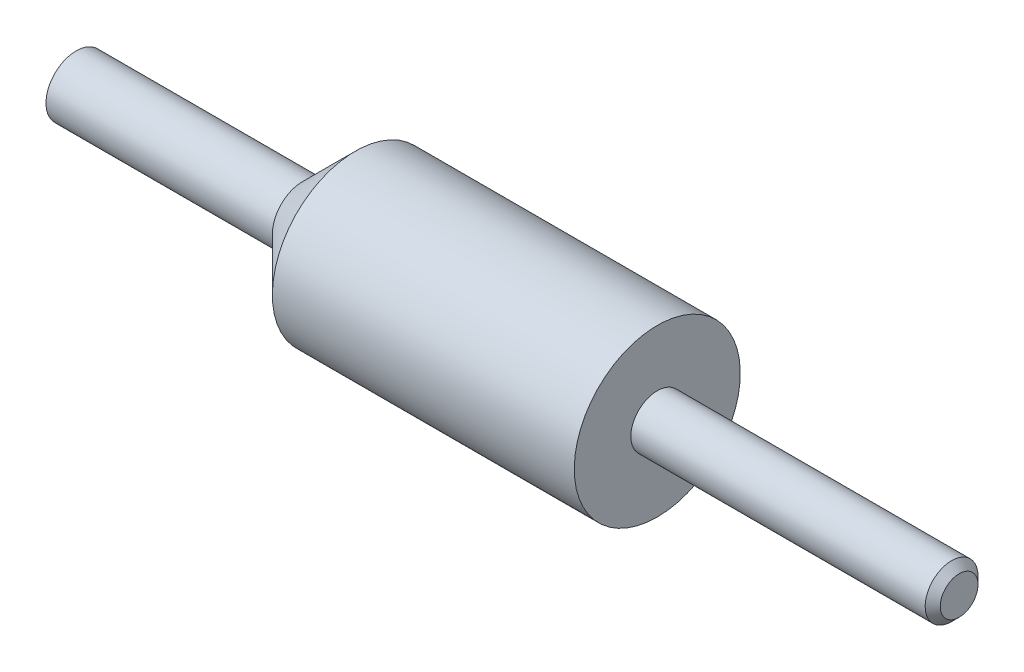
ISO-10303-21;
HEADER;
FILE_DESCRIPTION(('STEP AP214'),'2;1');
FILE_NAME('part.step','',(''),(''),'','','');
FILE_SCHEMA(('AUTOMOTIVE_DESIGN { 1 0 10303 214 1 1 1 1 }'));
ENDSEC;
DATA;
#1=APPLICATION_CONTEXT('core data for automotive mechanical design processes');
#2=APPLICATION_PROTOCOL_DEFINITION('international standard','automotive_design',2000,#1);
#3=PRODUCT_CONTEXT('',#1,'mechanical');
#4=PRODUCT('Part','Part','',(#3));
#5=PRODUCT_RELATED_PRODUCT_CATEGORY('part','',(#4));
#6=PRODUCT_DEFINITION_FORMATION('','',#4);
#7=PRODUCT_DEFINITION_CONTEXT('part definition',#1,'design');
#8=PRODUCT_DEFINITION('design','',#6,#7);
#9=PRODUCT_DEFINITION_SHAPE('','',#8);
#10=(LENGTH_UNIT() NAMED_UNIT(*) SI_UNIT(.MILLI.,.METRE.));
#11=(NAMED_UNIT(*) PLANE_ANGLE_UNIT() SI_UNIT($,.RADIAN.));
#12=(NAMED_UNIT(*) SI_UNIT($,.STERADIAN.) SOLID_ANGLE_UNIT());
#13=UNCERTAINTY_MEASURE_WITH_UNIT(LENGTH_MEASURE(1.E-05),#10,'distance_accuracy_value','');
#14=(GEOMETRIC_REPRESENTATION_CONTEXT(3) GLOBAL_UNCERTAINTY_ASSIGNED_CONTEXT((#13)) GLOBAL_UNIT_ASSIGNED_CONTEXT((#10,
#11,#12)) REPRESENTATION_CONTEXT('',''));
#15=CARTESIAN_POINT('',(0.,0.,0.));
#16=DIRECTION('',(0.,0.,1.));
#17=DIRECTION('',(1.,0.,0.));
#18=AXIS2_PLACEMENT_3D('',#15,#16,#17);
#19=CARTESIAN_POINT('',(-58.5,2.,0.));
#20=DIRECTION('',(1.,0.,0.));
#21=DIRECTION('',(0.,1.,0.));
#22=AXIS2_PLACEMENT_3D('',#19,#20,#21);
#23=PLANE('',#22);
#24=CARTESIAN_POINT('',(-58.5,0.,0.));
#25=DIRECTION('',(-1.,0.,0.));
#26=DIRECTION('',(0.,-1.,0.));
#27=AXIS2_PLACEMENT_3D('',#24,#25,#26);
#28=CIRCLE('',#27,2.);
#29=CARTESIAN_POINT('',(-58.5,-2.,0.));
#30=VERTEX_POINT('',#29);
#31=EDGE_CURVE('E72',#30,#30,#28,.T.);
#32=ORIENTED_EDGE('',*,*,#31,.T.);
#33=EDGE_LOOP('',(#32));
#34=FACE_BOUND('',#33,.T.);
#35=ADVANCED_FACE('F45',(#34),#23,.F.);
#36=CARTESIAN_POINT('',(0.,0.,0.));
#37=DIRECTION('',(-1.,0.,0.));
#38=DIRECTION('',(0.,-1.,0.));
#39=AXIS2_PLACEMENT_3D('',#36,#37,#38);
#40=PLANE('',#39);
#41=CARTESIAN_POINT('',(0.,0.,0.));
#42=DIRECTION('',(-1.,0.,0.));
#43=DIRECTION('',(0.,-1.,0.));
#44=AXIS2_PLACEMENT_3D('',#41,#42,#43);
#45=CIRCLE('',#44,1.25);
#46=CARTESIAN_POINT('',(0.,-1.25,0.));
#47=VERTEX_POINT('',#46);
#48=EDGE_CURVE('E10',#47,#47,#45,.F.);
#49=ORIENTED_EDGE('',*,*,#48,.T.);
#50=EDGE_LOOP('',(#49));
#51=FACE_BOUND('',#50,.T.);
#52=ADVANCED_FACE('F103',(#51),#40,.F.);
#53=CARTESIAN_POINT('',(-58.5,0.,0.));
#54=DIRECTION('',(-1.,0.,0.));
#55=DIRECTION('',(0.,-1.,0.));
#56=AXIS2_PLACEMENT_3D('',#53,#54,#55);
#57=CYLINDRICAL_SURFACE('',#56,1.75);
#58=CARTESIAN_POINT('',(-0.5,0.,0.));
#59=DIRECTION('',(-1.,0.,0.));
#60=DIRECTION('',(0.,-1.,0.));
#61=AXIS2_PLACEMENT_3D('',#58,#59,#60);
#62=CIRCLE('',#61,1.75);
#63=CARTESIAN_POINT('',(-0.5,-1.75,0.));
#64=VERTEX_POINT('',#63);
#65=EDGE_CURVE('E53',#64,#64,#62,.T.);
#66=ORIENTED_EDGE('',*,*,#65,.T.);
#67=EDGE_LOOP('',(#66));
#68=FACE_BOUND('',#67,.T.);
#69=CARTESIAN_POINT('',(-20.,0.,0.));
#70=DIRECTION('',(-1.,0.,0.));
#71=DIRECTION('',(0.,-1.,0.));
#72=AXIS2_PLACEMENT_3D('',#69,#70,#71);
#73=CIRCLE('',#72,1.75);
#74=CARTESIAN_POINT('',(-20.,-1.75,0.));
#75=VERTEX_POINT('',#74);
#76=EDGE_CURVE('E57',#75,#75,#73,.T.);
#77=ORIENTED_EDGE('',*,*,#76,.F.);
#78=EDGE_LOOP('',(#77));
#79=FACE_BOUND('',#78,.T.);
#80=ADVANCED_FACE('F98',(#68,#79),#57,.T.);
#81=CARTESIAN_POINT('',(-20.,1.75,0.));
#82=DIRECTION('',(-1.,0.,0.));
#83=DIRECTION('',(0.,-1.,0.));
#84=AXIS2_PLACEMENT_3D('',#81,#82,#83);
#85=PLANE('',#84);
#86=CARTESIAN_POINT('',(-20.,0.,0.));
#87=DIRECTION('',(-1.,0.,0.));
#88=DIRECTION('',(0.,-1.,0.));
#89=AXIS2_PLACEMENT_3D('',#86,#87,#88);
#90=CIRCLE('',#89,5.5);
#91=CARTESIAN_POINT('',(-20.,-5.5,0.));
#92=VERTEX_POINT('',#91);
#93=EDGE_CURVE('E61',#92,#92,#90,.T.);
#94=ORIENTED_EDGE('',*,*,#93,.F.);
#95=EDGE_LOOP('',(#94));
#96=FACE_BOUND('',#95,.T.);
#97=ORIENTED_EDGE('',*,*,#76,.T.);
#98=EDGE_LOOP('',(#97));
#99=FACE_BOUND('',#98,.T.);
#100=ADVANCED_FACE('F92',(#96,#99),#85,.F.);
#101=CARTESIAN_POINT('',(-58.5,0.,0.));
#102=DIRECTION('',(-1.,0.,0.));
#103=DIRECTION('',(0.,-1.,0.));
#104=AXIS2_PLACEMENT_3D('',#101,#102,#103);
#105=CYLINDRICAL_SURFACE('',#104,5.5);
#106=CARTESIAN_POINT('',(-40.,0.,0.));
#107=DIRECTION('',(-1.,0.,0.));
#108=DIRECTION('',(0.,-1.,0.));
#109=AXIS2_PLACEMENT_3D('',#106,#107,#108);
#110=CIRCLE('',#109,5.5);
#111=CARTESIAN_POINT('',(-40.,-5.5,0.));
#112=VERTEX_POINT('',#111);
#113=EDGE_CURVE('E66',#112,#112,#110,.T.);
#114=ORIENTED_EDGE('',*,*,#113,.F.);
#115=EDGE_LOOP('',(#114));
#116=FACE_BOUND('',#115,.T.);
#117=ORIENTED_EDGE('',*,*,#93,.T.);
#118=EDGE_LOOP('',(#117));
#119=FACE_BOUND('',#118,.T.);
#120=ADVANCED_FACE('F86',(#116,#119),#105,.T.);
#121=CARTESIAN_POINT('',(-40.,0.,0.));
#122=DIRECTION('',(1.,0.,0.));
#123=DIRECTION('',(0.,1.,0.));
#124=AXIS2_PLACEMENT_3D('',#121,#122,#123);
#125=CONICAL_SURFACE('',#124,5.5,0.78539816339745);
#126=CARTESIAN_POINT('',(-43.5,0.,0.));
#127=DIRECTION('',(-1.,0.,0.));
#128=DIRECTION('',(0.,-1.,0.));
#129=AXIS2_PLACEMENT_3D('',#126,#127,#128);
#130=CIRCLE('',#129,2.);
#131=CARTESIAN_POINT('',(-43.5,-2.,0.));
#132=VERTEX_POINT('',#131);
#133=EDGE_CURVE('E69',#132,#132,#130,.T.);
#134=ORIENTED_EDGE('',*,*,#133,.F.);
#135=EDGE_LOOP('',(#134));
#136=FACE_BOUND('',#135,.T.);
#137=ORIENTED_EDGE('',*,*,#113,.T.);
#138=EDGE_LOOP('',(#137));
#139=FACE_BOUND('',#138,.T.);
#140=ADVANCED_FACE('F80',(#136,#139),#125,.T.);
#141=CARTESIAN_POINT('',(-58.5,0.,0.));
#142=DIRECTION('',(-1.,0.,0.));
#143=DIRECTION('',(0.,-1.,0.));
#144=AXIS2_PLACEMENT_3D('',#141,#142,#143);
#145=CYLINDRICAL_SURFACE('',#144,2.);
#146=ORIENTED_EDGE('',*,*,#31,.F.);
#147=EDGE_LOOP('',(#146));
#148=FACE_BOUND('',#147,.T.);
#149=ORIENTED_EDGE('',*,*,#133,.T.);
#150=EDGE_LOOP('',(#149));
#151=FACE_BOUND('',#150,.T.);
#152=ADVANCED_FACE('F77',(#148,#151),#145,.T.);
#153=CARTESIAN_POINT('',(-0.5,0.,0.));
#154=DIRECTION('',(-1.,0.,0.));
#155=DIRECTION('',(0.,-1.,0.));
#156=AXIS2_PLACEMENT_3D('',#153,#154,#155);
#157=CONICAL_SURFACE('',#156,1.75,0.785398163397446);
#158=ORIENTED_EDGE('',*,*,#48,.F.);
#159=EDGE_LOOP('',(#158));
#160=FACE_BOUND('',#159,.T.);
#161=ORIENTED_EDGE('',*,*,#65,.F.);
#162=EDGE_LOOP('',(#161));
#163=FACE_BOUND('',#162,.T.);
#164=ADVANCED_FACE('F48',(#160,#163),#157,.T.);
#165=CLOSED_SHELL('',(#35,#52,#80,#100,#120,#140,#152,#164));
#166=MANIFOLD_SOLID_BREP('B2',#165);
#167=ADVANCED_BREP_SHAPE_REPRESENTATION('',(#18,#166),#14);
#168=SHAPE_DEFINITION_REPRESENTATION(#9,#167);
ENDSEC;
END-ISO-10303-21;
